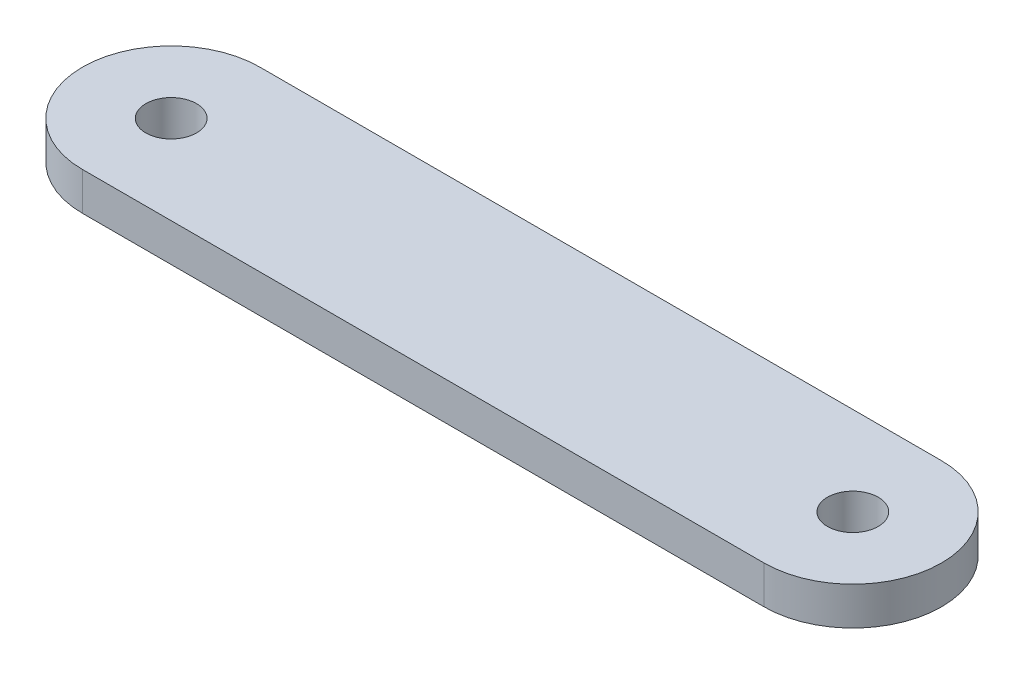
ISO-10303-21;
HEADER;
FILE_DESCRIPTION(('STEP AP214'),'2;1');
FILE_NAME('part.step','',(''),(''),'','','');
FILE_SCHEMA(('AUTOMOTIVE_DESIGN { 1 0 10303 214 1 1 1 1 }'));
ENDSEC;
DATA;
#1=APPLICATION_CONTEXT('core data for automotive mechanical design processes');
#2=APPLICATION_PROTOCOL_DEFINITION('international standard','automotive_design',2000,#1);
#3=PRODUCT_CONTEXT('',#1,'mechanical');
#4=PRODUCT('Part','Part','',(#3));
#5=PRODUCT_RELATED_PRODUCT_CATEGORY('part','',(#4));
#6=PRODUCT_DEFINITION_FORMATION('','',#4);
#7=PRODUCT_DEFINITION_CONTEXT('part definition',#1,'design');
#8=PRODUCT_DEFINITION('design','',#6,#7);
#9=PRODUCT_DEFINITION_SHAPE('','',#8);
#10=(LENGTH_UNIT() NAMED_UNIT(*) SI_UNIT(.MILLI.,.METRE.));
#11=(NAMED_UNIT(*) PLANE_ANGLE_UNIT() SI_UNIT($,.RADIAN.));
#12=(NAMED_UNIT(*) SI_UNIT($,.STERADIAN.) SOLID_ANGLE_UNIT());
#13=UNCERTAINTY_MEASURE_WITH_UNIT(LENGTH_MEASURE(1.E-05),#10,'distance_accuracy_value','');
#14=(GEOMETRIC_REPRESENTATION_CONTEXT(3) GLOBAL_UNCERTAINTY_ASSIGNED_CONTEXT((#13)) GLOBAL_UNIT_ASSIGNED_CONTEXT((#10,
#11,#12)) REPRESENTATION_CONTEXT('',''));
#15=CARTESIAN_POINT('',(0.,0.,0.));
#16=DIRECTION('',(0.,0.,1.));
#17=DIRECTION('',(1.,0.,0.));
#18=AXIS2_PLACEMENT_3D('',#15,#16,#17);
#19=CARTESIAN_POINT('',(-26.905,3.,0.));
#20=DIRECTION('',(0.,1.,0.));
#21=DIRECTION('',(0.,0.,1.));
#22=AXIS2_PLACEMENT_3D('',#19,#20,#21);
#23=PLANE('',#22);
#24=CARTESIAN_POINT('',(-26.905,3.,0.));
#25=DIRECTION('',(0.,1.,0.));
#26=DIRECTION('',(0.,0.,1.));
#27=AXIS2_PLACEMENT_3D('',#24,#25,#26);
#28=CIRCLE('',#27,2.005);
#29=CARTESIAN_POINT('',(-26.905,3.,2.005));
#30=VERTEX_POINT('',#29);
#31=EDGE_CURVE('E112',#30,#30,#28,.T.);
#32=ORIENTED_EDGE('',*,*,#31,.F.);
#33=EDGE_LOOP('',(#32));
#34=FACE_BOUND('',#33,.T.);
#35=CARTESIAN_POINT('',(-26.905,3.,0.));
#36=DIRECTION('',(0.,1.,0.));
#37=DIRECTION('',(0.,0.,1.));
#38=AXIS2_PLACEMENT_3D('',#35,#36,#37);
#39=CIRCLE('',#38,7.);
#40=CARTESIAN_POINT('',(-26.905,3.,-7.));
#41=VERTEX_POINT('',#40);
#42=CARTESIAN_POINT('',(-26.905,3.,7.));
#43=VERTEX_POINT('',#42);
#44=EDGE_CURVE('E92',#41,#43,#39,.T.);
#45=ORIENTED_EDGE('',*,*,#44,.T.);
#46=DIRECTION('',(1.,0.,0.));
#47=VECTOR('',#46,1.);
#48=CARTESIAN_POINT('',(-26.905,3.,7.));
#49=LINE('',#48,#47);
#50=CARTESIAN_POINT('',(26.905,3.,7.));
#51=VERTEX_POINT('',#50);
#52=EDGE_CURVE('E87',#43,#51,#49,.T.);
#53=ORIENTED_EDGE('',*,*,#52,.T.);
#54=CARTESIAN_POINT('',(26.905,3.,0.));
#55=DIRECTION('',(0.,1.,0.));
#56=DIRECTION('',(0.,0.,1.));
#57=AXIS2_PLACEMENT_3D('',#54,#55,#56);
#58=CIRCLE('',#57,7.);
#59=CARTESIAN_POINT('',(26.905,3.,-7.));
#60=VERTEX_POINT('',#59);
#61=EDGE_CURVE('E90',#51,#60,#58,.T.);
#62=ORIENTED_EDGE('',*,*,#61,.T.);
#63=DIRECTION('',(-1.,0.,0.));
#64=VECTOR('',#63,1.);
#65=CARTESIAN_POINT('',(-26.905,3.,-7.));
#66=LINE('',#65,#64);
#67=EDGE_CURVE('E57',#60,#41,#66,.T.);
#68=ORIENTED_EDGE('',*,*,#67,.T.);
#69=EDGE_LOOP('',(#45,#53,#62,#68));
#70=FACE_BOUND('',#69,.T.);
#71=CARTESIAN_POINT('',(26.905,3.,0.));
#72=DIRECTION('',(0.,1.,0.));
#73=DIRECTION('',(0.,0.,1.));
#74=AXIS2_PLACEMENT_3D('',#71,#72,#73);
#75=CIRCLE('',#74,2.005);
#76=CARTESIAN_POINT('',(26.905,3.,2.005));
#77=VERTEX_POINT('',#76);
#78=EDGE_CURVE('E134',#77,#77,#75,.T.);
#79=ORIENTED_EDGE('',*,*,#78,.F.);
#80=EDGE_LOOP('',(#79));
#81=FACE_BOUND('',#80,.T.);
#82=ADVANCED_FACE('F39',(#34,#70,#81),#23,.T.);
#83=CARTESIAN_POINT('',(-26.905,0.,0.));
#84=DIRECTION('',(0.,1.,0.));
#85=DIRECTION('',(0.,0.,1.));
#86=AXIS2_PLACEMENT_3D('',#83,#84,#85);
#87=PLANE('',#86);
#88=CARTESIAN_POINT('',(-26.905,0.,0.));
#89=DIRECTION('',(0.,1.,0.));
#90=DIRECTION('',(0.,0.,1.));
#91=AXIS2_PLACEMENT_3D('',#88,#89,#90);
#92=CIRCLE('',#91,7.);
#93=CARTESIAN_POINT('',(-26.905,0.,-7.));
#94=VERTEX_POINT('',#93);
#95=CARTESIAN_POINT('',(-26.905,0.,7.));
#96=VERTEX_POINT('',#95);
#97=EDGE_CURVE('E108',#94,#96,#92,.T.);
#98=ORIENTED_EDGE('',*,*,#97,.F.);
#99=DIRECTION('',(-1.,0.,0.));
#100=VECTOR('',#99,1.);
#101=CARTESIAN_POINT('',(-26.905,0.,-7.));
#102=LINE('',#101,#100);
#103=CARTESIAN_POINT('',(26.905,0.,-7.));
#104=VERTEX_POINT('',#103);
#105=EDGE_CURVE('E80',#104,#94,#102,.T.);
#106=ORIENTED_EDGE('',*,*,#105,.F.);
#107=CARTESIAN_POINT('',(26.905,0.,0.));
#108=DIRECTION('',(0.,1.,0.));
#109=DIRECTION('',(0.,0.,1.));
#110=AXIS2_PLACEMENT_3D('',#107,#108,#109);
#111=CIRCLE('',#110,7.);
#112=CARTESIAN_POINT('',(26.905,0.,7.));
#113=VERTEX_POINT('',#112);
#114=EDGE_CURVE('E74',#113,#104,#111,.T.);
#115=ORIENTED_EDGE('',*,*,#114,.F.);
#116=DIRECTION('',(1.,0.,0.));
#117=VECTOR('',#116,1.);
#118=CARTESIAN_POINT('',(-26.905,0.,7.));
#119=LINE('',#118,#117);
#120=EDGE_CURVE('E97',#96,#113,#119,.T.);
#121=ORIENTED_EDGE('',*,*,#120,.F.);
#122=EDGE_LOOP('',(#98,#106,#115,#121));
#123=FACE_BOUND('',#122,.T.);
#124=CARTESIAN_POINT('',(-26.905,0.,0.));
#125=DIRECTION('',(0.,1.,0.));
#126=DIRECTION('',(0.,0.,1.));
#127=AXIS2_PLACEMENT_3D('',#124,#125,#126);
#128=CIRCLE('',#127,2.005);
#129=CARTESIAN_POINT('',(-26.905,0.,2.005));
#130=VERTEX_POINT('',#129);
#131=EDGE_CURVE('E130',#130,#130,#128,.T.);
#132=ORIENTED_EDGE('',*,*,#131,.T.);
#133=EDGE_LOOP('',(#132));
#134=FACE_BOUND('',#133,.T.);
#135=CARTESIAN_POINT('',(26.905,0.,0.));
#136=DIRECTION('',(0.,1.,0.));
#137=DIRECTION('',(0.,0.,1.));
#138=AXIS2_PLACEMENT_3D('',#135,#136,#137);
#139=CIRCLE('',#138,2.005);
#140=CARTESIAN_POINT('',(26.905,0.,2.005));
#141=VERTEX_POINT('',#140);
#142=EDGE_CURVE('E138',#141,#141,#139,.T.);
#143=ORIENTED_EDGE('',*,*,#142,.T.);
#144=EDGE_LOOP('',(#143));
#145=FACE_BOUND('',#144,.T.);
#146=ADVANCED_FACE('F125',(#123,#134,#145),#87,.F.);
#147=CARTESIAN_POINT('',(-26.905,3.,0.));
#148=DIRECTION('',(0.,-1.,0.));
#149=DIRECTION('',(0.,0.,-1.));
#150=AXIS2_PLACEMENT_3D('',#147,#148,#149);
#151=CYLINDRICAL_SURFACE('',#150,7.);
#152=ORIENTED_EDGE('',*,*,#97,.T.);
#153=DIRECTION('',(0.,-1.,0.));
#154=VECTOR('',#153,1.);
#155=CARTESIAN_POINT('',(-26.905,3.,7.));
#156=LINE('',#155,#154);
#157=EDGE_CURVE('E11',#43,#96,#156,.T.);
#158=ORIENTED_EDGE('',*,*,#157,.F.);
#159=ORIENTED_EDGE('',*,*,#44,.F.);
#160=DIRECTION('',(0.,-1.,0.));
#161=VECTOR('',#160,1.);
#162=CARTESIAN_POINT('',(-26.905,3.,-7.));
#163=LINE('',#162,#161);
#164=EDGE_CURVE('E104',#41,#94,#163,.T.);
#165=ORIENTED_EDGE('',*,*,#164,.T.);
#166=EDGE_LOOP('',(#152,#158,#159,#165));
#167=FACE_BOUND('',#166,.T.);
#168=ADVANCED_FACE('F41',(#167),#151,.T.);
#169=CARTESIAN_POINT('',(-26.905,3.,7.));
#170=DIRECTION('',(0.,0.,-1.));
#171=DIRECTION('',(-1.,0.,0.));
#172=AXIS2_PLACEMENT_3D('',#169,#170,#171);
#173=PLANE('',#172);
#174=ORIENTED_EDGE('',*,*,#120,.T.);
#175=DIRECTION('',(0.,-1.,0.));
#176=VECTOR('',#175,1.);
#177=CARTESIAN_POINT('',(26.905,3.,7.));
#178=LINE('',#177,#176);
#179=EDGE_CURVE('E49',#51,#113,#178,.T.);
#180=ORIENTED_EDGE('',*,*,#179,.F.);
#181=ORIENTED_EDGE('',*,*,#52,.F.);
#182=ORIENTED_EDGE('',*,*,#157,.T.);
#183=EDGE_LOOP('',(#174,#180,#181,#182));
#184=FACE_BOUND('',#183,.T.);
#185=ADVANCED_FACE('F96',(#184),#173,.F.);
#186=CARTESIAN_POINT('',(26.905,3.,0.));
#187=DIRECTION('',(0.,-1.,0.));
#188=DIRECTION('',(0.,0.,-1.));
#189=AXIS2_PLACEMENT_3D('',#186,#187,#188);
#190=CYLINDRICAL_SURFACE('',#189,7.);
#191=ORIENTED_EDGE('',*,*,#114,.T.);
#192=DIRECTION('',(0.,-1.,0.));
#193=VECTOR('',#192,1.);
#194=CARTESIAN_POINT('',(26.905,3.,-7.));
#195=LINE('',#194,#193);
#196=EDGE_CURVE('E99',#60,#104,#195,.T.);
#197=ORIENTED_EDGE('',*,*,#196,.F.);
#198=ORIENTED_EDGE('',*,*,#61,.F.);
#199=ORIENTED_EDGE('',*,*,#179,.T.);
#200=EDGE_LOOP('',(#191,#197,#198,#199));
#201=FACE_BOUND('',#200,.T.);
#202=ADVANCED_FACE('F100',(#201),#190,.T.);
#203=CARTESIAN_POINT('',(-26.905,3.,-7.));
#204=DIRECTION('',(0.,0.,1.));
#205=DIRECTION('',(1.,0.,0.));
#206=AXIS2_PLACEMENT_3D('',#203,#204,#205);
#207=PLANE('',#206);
#208=ORIENTED_EDGE('',*,*,#105,.T.);
#209=ORIENTED_EDGE('',*,*,#164,.F.);
#210=ORIENTED_EDGE('',*,*,#67,.F.);
#211=ORIENTED_EDGE('',*,*,#196,.T.);
#212=EDGE_LOOP('',(#208,#209,#210,#211));
#213=FACE_BOUND('',#212,.T.);
#214=ADVANCED_FACE('F122',(#213),#207,.F.);
#215=CARTESIAN_POINT('',(-26.905,3.,0.));
#216=DIRECTION('',(0.,-1.,0.));
#217=DIRECTION('',(0.,0.,-1.));
#218=AXIS2_PLACEMENT_3D('',#215,#216,#217);
#219=CYLINDRICAL_SURFACE('',#218,2.005);
#220=ORIENTED_EDGE('',*,*,#31,.T.);
#221=EDGE_LOOP('',(#220));
#222=FACE_BOUND('',#221,.T.);
#223=ORIENTED_EDGE('',*,*,#131,.F.);
#224=EDGE_LOOP('',(#223));
#225=FACE_BOUND('',#224,.T.);
#226=ADVANCED_FACE('F157',(#222,#225),#219,.F.);
#227=CARTESIAN_POINT('',(26.905,3.,0.));
#228=DIRECTION('',(0.,-1.,0.));
#229=DIRECTION('',(0.,0.,-1.));
#230=AXIS2_PLACEMENT_3D('',#227,#228,#229);
#231=CYLINDRICAL_SURFACE('',#230,2.005);
#232=ORIENTED_EDGE('',*,*,#78,.T.);
#233=EDGE_LOOP('',(#232));
#234=FACE_BOUND('',#233,.T.);
#235=ORIENTED_EDGE('',*,*,#142,.F.);
#236=EDGE_LOOP('',(#235));
#237=FACE_BOUND('',#236,.T.);
#238=ADVANCED_FACE('F146',(#234,#237),#231,.F.);
#239=CLOSED_SHELL('',(#82,#146,#168,#185,#202,#214,#226,#238));
#240=MANIFOLD_SOLID_BREP('B2',#239);
#241=ADVANCED_BREP_SHAPE_REPRESENTATION('',(#18,#240),#14);
#242=SHAPE_DEFINITION_REPRESENTATION(#9,#241);
ENDSEC;
END-ISO-10303-21;
